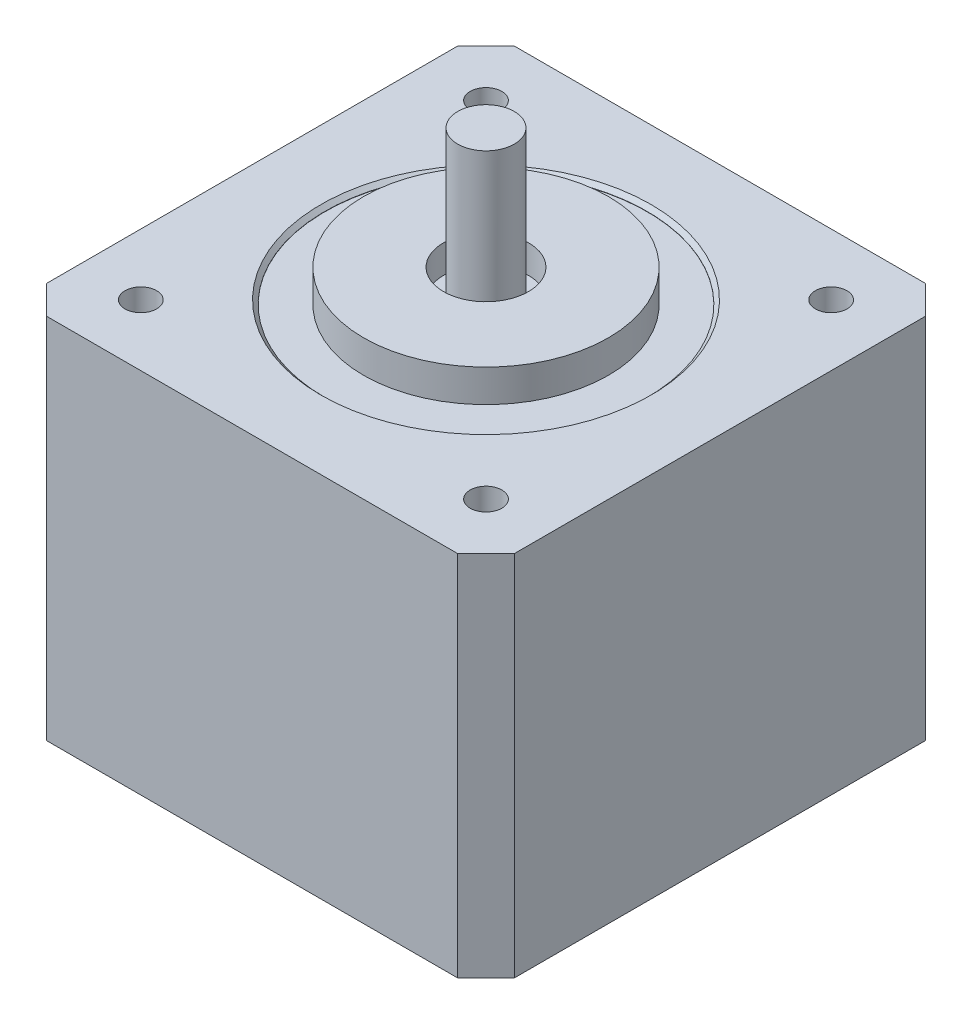
ISO-10303-21;
HEADER;
FILE_DESCRIPTION(('STEP AP214'),'2;1');
FILE_NAME('part.step','',(''),(''),'','','');
FILE_SCHEMA(('AUTOMOTIVE_DESIGN { 1 0 10303 214 1 1 1 1 }'));
ENDSEC;
DATA;
#1=APPLICATION_CONTEXT('core data for automotive mechanical design processes');
#2=APPLICATION_PROTOCOL_DEFINITION('international standard','automotive_design',2000,#1);
#3=PRODUCT_CONTEXT('',#1,'mechanical');
#4=PRODUCT('Part','Part','',(#3));
#5=PRODUCT_RELATED_PRODUCT_CATEGORY('part','',(#4));
#6=PRODUCT_DEFINITION_FORMATION('','',#4);
#7=PRODUCT_DEFINITION_CONTEXT('part definition',#1,'design');
#8=PRODUCT_DEFINITION('design','',#6,#7);
#9=PRODUCT_DEFINITION_SHAPE('','',#8);
#10=(LENGTH_UNIT() NAMED_UNIT(*) SI_UNIT(.MILLI.,.METRE.));
#11=(NAMED_UNIT(*) PLANE_ANGLE_UNIT() SI_UNIT($,.RADIAN.));
#12=(NAMED_UNIT(*) SI_UNIT($,.STERADIAN.) SOLID_ANGLE_UNIT());
#13=UNCERTAINTY_MEASURE_WITH_UNIT(LENGTH_MEASURE(1.E-05),#10,'distance_accuracy_value','');
#14=(GEOMETRIC_REPRESENTATION_CONTEXT(3) GLOBAL_UNCERTAINTY_ASSIGNED_CONTEXT((#13)) GLOBAL_UNIT_ASSIGNED_CONTEXT((#10,
#11,#12)) REPRESENTATION_CONTEXT('',''));
#15=CARTESIAN_POINT('',(0.,0.,0.));
#16=DIRECTION('',(0.,0.,1.));
#17=DIRECTION('',(1.,0.,0.));
#18=AXIS2_PLACEMENT_3D('',#15,#16,#17);
#19=CARTESIAN_POINT('',(21.0185,33.02,-21.0185));
#20=DIRECTION('',(0.,-1.,0.));
#21=DIRECTION('',(0.,0.,-1.));
#22=AXIS2_PLACEMENT_3D('',#19,#20,#21);
#23=PLANE('',#22);
#24=CARTESIAN_POINT('',(0.,33.02,0.));
#25=DIRECTION('',(0.,1.,0.));
#26=DIRECTION('',(0.,0.,1.));
#27=AXIS2_PLACEMENT_3D('',#24,#25,#26);
#28=CIRCLE('',#27,3.81);
#29=CARTESIAN_POINT('',(0.,33.02,3.81));
#30=VERTEX_POINT('',#29);
#31=EDGE_CURVE('E180',#30,#30,#28,.T.);
#32=ORIENTED_EDGE('',*,*,#31,.T.);
#33=EDGE_LOOP('',(#32));
#34=FACE_BOUND('',#33,.T.);
#35=CARTESIAN_POINT('',(0.,33.02,0.));
#36=DIRECTION('',(0.,-1.,0.));
#37=DIRECTION('',(0.,0.,-1.));
#38=AXIS2_PLACEMENT_3D('',#35,#36,#37);
#39=CIRCLE('',#38,2.54);
#40=CARTESIAN_POINT('',(0.,33.02,-2.54));
#41=VERTEX_POINT('',#40);
#42=EDGE_CURVE('E11',#41,#41,#39,.F.);
#43=ORIENTED_EDGE('',*,*,#42,.F.);
#44=EDGE_LOOP('',(#43));
#45=FACE_BOUND('',#44,.T.);
#46=ADVANCED_FACE('F32',(#34,#45),#23,.F.);
#47=CARTESIAN_POINT('',(0.,35.56,0.));
#48=DIRECTION('',(0.,1.,0.));
#49=DIRECTION('',(0.,0.,1.));
#50=AXIS2_PLACEMENT_3D('',#47,#48,#49);
#51=PLANE('',#50);
#52=CARTESIAN_POINT('',(0.,35.56,0.));
#53=DIRECTION('',(0.,1.,0.));
#54=DIRECTION('',(0.,0.,1.));
#55=AXIS2_PLACEMENT_3D('',#52,#53,#54);
#56=CIRCLE('',#55,10.9982);
#57=CARTESIAN_POINT('',(0.,35.56,10.9982));
#58=VERTEX_POINT('',#57);
#59=EDGE_CURVE('E192',#58,#58,#56,.T.);
#60=ORIENTED_EDGE('',*,*,#59,.T.);
#61=EDGE_LOOP('',(#60));
#62=FACE_BOUND('',#61,.T.);
#63=CARTESIAN_POINT('',(0.,35.56,0.));
#64=DIRECTION('',(0.,1.,0.));
#65=DIRECTION('',(0.,0.,1.));
#66=AXIS2_PLACEMENT_3D('',#63,#64,#65);
#67=CIRCLE('',#66,3.81);
#68=CARTESIAN_POINT('',(0.,35.56,3.81));
#69=VERTEX_POINT('',#68);
#70=EDGE_CURVE('E184',#69,#69,#67,.T.);
#71=ORIENTED_EDGE('',*,*,#70,.F.);
#72=EDGE_LOOP('',(#71));
#73=FACE_BOUND('',#72,.T.);
#74=ADVANCED_FACE('F228',(#62,#73),#51,.T.);
#75=CARTESIAN_POINT('',(0.,35.56,0.));
#76=DIRECTION('',(0.,-1.,0.));
#77=DIRECTION('',(0.,0.,-1.));
#78=AXIS2_PLACEMENT_3D('',#75,#76,#77);
#79=CYLINDRICAL_SURFACE('',#78,10.9982);
#80=ORIENTED_EDGE('',*,*,#59,.F.);
#81=EDGE_LOOP('',(#80));
#82=FACE_BOUND('',#81,.T.);
#83=CARTESIAN_POINT('',(0.,32.639,0.));
#84=DIRECTION('',(0.,1.,0.));
#85=DIRECTION('',(0.,0.,1.));
#86=AXIS2_PLACEMENT_3D('',#83,#84,#85);
#87=CIRCLE('',#86,10.9982);
#88=CARTESIAN_POINT('',(0.,32.639,10.9982));
#89=VERTEX_POINT('',#88);
#90=EDGE_CURVE('E181',#89,#89,#87,.T.);
#91=ORIENTED_EDGE('',*,*,#90,.T.);
#92=EDGE_LOOP('',(#91));
#93=FACE_BOUND('',#92,.T.);
#94=ADVANCED_FACE('F233',(#82,#93),#79,.T.);
#95=CARTESIAN_POINT('',(0.,35.56,0.));
#96=DIRECTION('',(0.,-1.,0.));
#97=DIRECTION('',(0.,0.,-1.));
#98=AXIS2_PLACEMENT_3D('',#95,#96,#97);
#99=CYLINDRICAL_SURFACE('',#98,3.81);
#100=ORIENTED_EDGE('',*,*,#70,.T.);
#101=EDGE_LOOP('',(#100));
#102=FACE_BOUND('',#101,.T.);
#103=ORIENTED_EDGE('',*,*,#31,.F.);
#104=EDGE_LOOP('',(#103));
#105=FACE_BOUND('',#104,.T.);
#106=ADVANCED_FACE('F174',(#102,#105),#99,.F.);
#107=CARTESIAN_POINT('',(0.,32.639,0.));
#108=DIRECTION('',(0.,1.,0.));
#109=DIRECTION('',(0.,0.,1.));
#110=AXIS2_PLACEMENT_3D('',#107,#108,#109);
#111=CYLINDRICAL_SURFACE('',#110,14.478);
#112=CARTESIAN_POINT('',(0.,32.6644,0.));
#113=DIRECTION('',(0.,-1.,0.));
#114=DIRECTION('',(0.,0.,-1.));
#115=AXIS2_PLACEMENT_3D('',#112,#113,#114);
#116=CIRCLE('',#115,14.478);
#117=CARTESIAN_POINT('',(0.,32.6644,14.478));
#118=VERTEX_POINT('',#117);
#119=EDGE_CURVE('E158',#118,#118,#116,.F.);
#120=CARTESIAN_POINT('',(0.,32.639,0.));
#121=DIRECTION('',(0.,1.,0.));
#122=DIRECTION('',(0.,0.,1.));
#123=AXIS2_PLACEMENT_3D('',#120,#121,#122);
#124=CIRCLE('',#123,14.478);
#125=CARTESIAN_POINT('',(0.,32.639,14.478));
#126=VERTEX_POINT('',#125);
#127=EDGE_CURVE('E178',#126,#126,#124,.T.);
#128=CARTESIAN_POINT('',(0.,32.6644,14.478));
#129=CARTESIAN_POINT('',(0.,32.6641354166666,14.478));
#130=CARTESIAN_POINT('',(0.,32.6638708333333,14.478));
#131=CARTESIAN_POINT('',(0.,32.6633416666666,14.478));
#132=CARTESIAN_POINT('',(0.,32.6630770833333,14.478));
#133=CARTESIAN_POINT('',(0.,32.6625479166666,14.478));
#134=CARTESIAN_POINT('',(0.,32.6622833333333,14.478));
#135=CARTESIAN_POINT('',(0.,32.6617541666666,14.478));
#136=CARTESIAN_POINT('',(0.,32.6614895833333,14.478));
#137=CARTESIAN_POINT('',(0.,32.6609604166666,14.478));
#138=CARTESIAN_POINT('',(0.,32.6606958333333,14.478));
#139=CARTESIAN_POINT('',(0.,32.6601666666666,14.478));
#140=CARTESIAN_POINT('',(0.,32.6599020833333,14.478));
#141=CARTESIAN_POINT('',(0.,32.6593729166666,14.478));
#142=CARTESIAN_POINT('',(0.,32.6591083333333,14.478));
#143=CARTESIAN_POINT('',(0.,32.6585791666666,14.478));
#144=CARTESIAN_POINT('',(0.,32.6583145833333,14.478));
#145=CARTESIAN_POINT('',(0.,32.6577854166666,14.478));
#146=CARTESIAN_POINT('',(0.,32.6575208333333,14.478));
#147=CARTESIAN_POINT('',(0.,32.6569916666666,14.478));
#148=CARTESIAN_POINT('',(0.,32.6567270833333,14.478));
#149=CARTESIAN_POINT('',(0.,32.6561979166666,14.478));
#150=CARTESIAN_POINT('',(0.,32.6559333333333,14.478));
#151=CARTESIAN_POINT('',(0.,32.6554041666666,14.478));
#152=CARTESIAN_POINT('',(0.,32.6551395833333,14.478));
#153=CARTESIAN_POINT('',(0.,32.6546104166666,14.478));
#154=CARTESIAN_POINT('',(0.,32.6543458333333,14.478));
#155=CARTESIAN_POINT('',(0.,32.6538166666666,14.478));
#156=CARTESIAN_POINT('',(0.,32.6535520833333,14.478));
#157=CARTESIAN_POINT('',(0.,32.6530229166666,14.478));
#158=CARTESIAN_POINT('',(0.,32.6527583333333,14.478));
#159=CARTESIAN_POINT('',(0.,32.6522291666666,14.478));
#160=CARTESIAN_POINT('',(0.,32.6519645833333,14.478));
#161=CARTESIAN_POINT('',(0.,32.6514354166666,14.478));
#162=CARTESIAN_POINT('',(0.,32.6511708333333,14.478));
#163=CARTESIAN_POINT('',(0.,32.6506416666666,14.478));
#164=CARTESIAN_POINT('',(0.,32.6503770833333,14.478));
#165=CARTESIAN_POINT('',(0.,32.6498479166666,14.478));
#166=CARTESIAN_POINT('',(0.,32.6495833333333,14.478));
#167=CARTESIAN_POINT('',(0.,32.6490541666666,14.478));
#168=CARTESIAN_POINT('',(0.,32.6487895833333,14.478));
#169=CARTESIAN_POINT('',(0.,32.6482604166666,14.478));
#170=CARTESIAN_POINT('',(0.,32.6479958333333,14.478));
#171=CARTESIAN_POINT('',(0.,32.6474666666666,14.478));
#172=CARTESIAN_POINT('',(0.,32.6472020833333,14.478));
#173=CARTESIAN_POINT('',(0.,32.6466729166666,14.478));
#174=CARTESIAN_POINT('',(0.,32.6464083333333,14.478));
#175=CARTESIAN_POINT('',(0.,32.6458791666666,14.478));
#176=CARTESIAN_POINT('',(0.,32.6456145833333,14.478));
#177=CARTESIAN_POINT('',(0.,32.6450854166667,14.478));
#178=CARTESIAN_POINT('',(0.,32.6448208333333,14.478));
#179=CARTESIAN_POINT('',(0.,32.6442916666667,14.478));
#180=CARTESIAN_POINT('',(0.,32.6440270833333,14.478));
#181=CARTESIAN_POINT('',(0.,32.6434979166667,14.478));
#182=CARTESIAN_POINT('',(0.,32.6432333333333,14.478));
#183=CARTESIAN_POINT('',(0.,32.6427041666667,14.478));
#184=CARTESIAN_POINT('',(0.,32.6424395833333,14.478));
#185=CARTESIAN_POINT('',(0.,32.6419104166667,14.478));
#186=CARTESIAN_POINT('',(0.,32.6416458333333,14.478));
#187=CARTESIAN_POINT('',(0.,32.6411166666667,14.478));
#188=CARTESIAN_POINT('',(0.,32.6408520833333,14.478));
#189=CARTESIAN_POINT('',(0.,32.6403229166667,14.478));
#190=CARTESIAN_POINT('',(0.,32.6400583333333,14.478));
#191=CARTESIAN_POINT('',(0.,32.6395291666667,14.478));
#192=CARTESIAN_POINT('',(0.,32.6392645833333,14.478));
#193=CARTESIAN_POINT('',(0.,32.639,14.478));
#194=B_SPLINE_CURVE_WITH_KNOTS('',3,(#128,#129,#130,#131,#132,#133,#134,#135,#136,#137,#138,
#139,#140,#141,#142,#143,#144,#145,#146,#147,#148,#149,#150,#151,#152,#153,#154,#155,#156,#157,
#158,#159,#160,#161,#162,#163,#164,#165,#166,#167,#168,#169,#170,#171,#172,#173,#174,#175,#176,
#177,#178,#179,#180,#181,#182,#183,#184,#185,#186,#187,#188,#189,#190,#191,#192,#193),
.UNSPECIFIED.,.F.,.F.,(4,2,2,2,2,2,2,2,2,2,2,2,2,2,2,2,2,2,2,2,2,2,2,2,2,2,2,2,2,2,2,2,4),(0.,
0.000793749999998539,0.00158749999999708,0.00238124999999562,0.00317499999999415,
0.00396874999999269,0.00476249999999123,0.00555624999998977,0.00634999999998831,
0.00714374999998685,0.00793749999998539,0.00873124999998393,0.00952499999998246,
0.010318749999981,0.0111124999999795,0.0119062499999781,0.0126999999999766,0.0134937499999752,
0.0142874999999737,0.0150812499999722,0.0158749999999708,0.0166687499999693,0.0174624999999679,
0.0182562499999664,0.0190499999999649,0.0198437499999635,0.020637499999962,0.0214312499999605,
0.0222249999999591,0.0230187499999576,0.0238124999999562,0.0246062499999547,0.0253999999999463),.UNSPECIFIED.);
#195=EDGE_CURVE('BSEAM170',#118,#126,#194,.T.);
#196=ORIENTED_EDGE('',*,*,#119,.T.);
#197=ORIENTED_EDGE('',*,*,#127,.F.);
#198=ORIENTED_EDGE('',*,*,#195,.T.);
#199=ORIENTED_EDGE('',*,*,#195,.F.);
#200=EDGE_LOOP('',(#196,#198,#197,#199));
#201=FACE_BOUND('',#200,.T.);
#202=ADVANCED_FACE('F170',(#201),#111,.F.);
#203=CARTESIAN_POINT('',(0.,32.639,0.));
#204=DIRECTION('',(0.,1.,0.));
#205=DIRECTION('',(0.,0.,1.));
#206=AXIS2_PLACEMENT_3D('',#203,#204,#205);
#207=PLANE('',#206);
#208=ORIENTED_EDGE('',*,*,#90,.F.);
#209=EDGE_LOOP('',(#208));
#210=FACE_BOUND('',#209,.T.);
#211=ORIENTED_EDGE('',*,*,#127,.T.);
#212=EDGE_LOOP('',(#211));
#213=FACE_BOUND('',#212,.T.);
#214=ADVANCED_FACE('F173',(#210,#213),#207,.T.);
#215=CARTESIAN_POINT('',(21.0185,0.,-21.0185));
#216=DIRECTION('',(0.,-1.,0.));
#217=DIRECTION('',(0.,0.,-1.));
#218=AXIS2_PLACEMENT_3D('',#215,#216,#217);
#219=PLANE('',#218);
#220=CARTESIAN_POINT('',(15.5067,0.,15.5067));
#221=DIRECTION('',(0.,1.,0.));
#222=DIRECTION('',(0.,0.,1.));
#223=AXIS2_PLACEMENT_3D('',#220,#221,#222);
#224=CIRCLE('',#223,1.4224);
#225=CARTESIAN_POINT('',(15.5067,0.,16.9291));
#226=VERTEX_POINT('',#225);
#227=EDGE_CURVE('E394',#226,#226,#224,.T.);
#228=ORIENTED_EDGE('',*,*,#227,.T.);
#229=EDGE_LOOP('',(#228));
#230=FACE_BOUND('',#229,.T.);
#231=CARTESIAN_POINT('',(-15.5067,0.,15.5067));
#232=DIRECTION('',(0.,1.,0.));
#233=DIRECTION('',(0.,0.,1.));
#234=AXIS2_PLACEMENT_3D('',#231,#232,#233);
#235=CIRCLE('',#234,1.4224);
#236=CARTESIAN_POINT('',(-15.5067,0.,16.9291));
#237=VERTEX_POINT('',#236);
#238=EDGE_CURVE('E388',#237,#237,#235,.T.);
#239=ORIENTED_EDGE('',*,*,#238,.T.);
#240=EDGE_LOOP('',(#239));
#241=FACE_BOUND('',#240,.T.);
#242=CARTESIAN_POINT('',(15.5067,0.,-15.5067));
#243=DIRECTION('',(0.,1.,0.));
#244=DIRECTION('',(0.,0.,1.));
#245=AXIS2_PLACEMENT_3D('',#242,#243,#244);
#246=CIRCLE('',#245,1.4224);
#247=CARTESIAN_POINT('',(15.5067,0.,-14.0843));
#248=VERTEX_POINT('',#247);
#249=EDGE_CURVE('E383',#248,#248,#246,.T.);
#250=ORIENTED_EDGE('',*,*,#249,.T.);
#251=EDGE_LOOP('',(#250));
#252=FACE_BOUND('',#251,.T.);
#253=CARTESIAN_POINT('',(-15.5067,0.,-15.5067));
#254=DIRECTION('',(0.,1.,0.));
#255=DIRECTION('',(0.,0.,1.));
#256=AXIS2_PLACEMENT_3D('',#253,#254,#255);
#257=CIRCLE('',#256,1.4224);
#258=CARTESIAN_POINT('',(-15.5067,0.,-14.0843));
#259=VERTEX_POINT('',#258);
#260=EDGE_CURVE('E377',#259,#259,#257,.T.);
#261=ORIENTED_EDGE('',*,*,#260,.T.);
#262=EDGE_LOOP('',(#261));
#263=FACE_BOUND('',#262,.T.);
#264=DIRECTION('',(0.,0.,1.));
#265=VECTOR('',#264,1.);
#266=CARTESIAN_POINT('',(-21.0185,0.,21.0185));
#267=LINE('',#266,#265);
#268=CARTESIAN_POINT('',(-21.0185,0.,-18.4785));
#269=VERTEX_POINT('',#268);
#270=CARTESIAN_POINT('',(-21.0185,0.,18.4785));
#271=VERTEX_POINT('',#270);
#272=EDGE_CURVE('E116',#269,#271,#267,.T.);
#273=ORIENTED_EDGE('',*,*,#272,.F.);
#274=DIRECTION('',(-0.707106781186549,0.,0.707106781186546));
#275=VECTOR('',#274,1.);
#276=CARTESIAN_POINT('',(1.2700000000001,0.,-40.767));
#277=LINE('',#276,#275);
#278=CARTESIAN_POINT('',(-18.4785,0.,-21.0185));
#279=VERTEX_POINT('',#278);
#280=EDGE_CURVE('E99',#269,#279,#277,.F.);
#281=ORIENTED_EDGE('',*,*,#280,.T.);
#282=DIRECTION('',(-1.,0.,0.));
#283=VECTOR('',#282,1.);
#284=CARTESIAN_POINT('',(-21.0185,0.,-21.0185));
#285=LINE('',#284,#283);
#286=CARTESIAN_POINT('',(18.4785,0.,-21.0185));
#287=VERTEX_POINT('',#286);
#288=EDGE_CURVE('E125',#287,#279,#285,.T.);
#289=ORIENTED_EDGE('',*,*,#288,.F.);
#290=DIRECTION('',(-0.707106781186546,0.,-0.707106781186549));
#291=VECTOR('',#290,1.);
#292=CARTESIAN_POINT('',(19.7485,0.,-19.7485));
#293=LINE('',#292,#291);
#294=CARTESIAN_POINT('',(21.0185,0.,-18.4785));
#295=VERTEX_POINT('',#294);
#296=EDGE_CURVE('E136',#287,#295,#293,.F.);
#297=ORIENTED_EDGE('',*,*,#296,.T.);
#298=DIRECTION('',(0.,0.,-1.));
#299=VECTOR('',#298,1.);
#300=CARTESIAN_POINT('',(21.0185,0.,21.0185));
#301=LINE('',#300,#299);
#302=CARTESIAN_POINT('',(21.0185,0.,18.4785));
#303=VERTEX_POINT('',#302);
#304=EDGE_CURVE('E129',#303,#295,#301,.T.);
#305=ORIENTED_EDGE('',*,*,#304,.F.);
#306=DIRECTION('',(0.707106781186549,0.,-0.707106781186546));
#307=VECTOR('',#306,1.);
#308=CARTESIAN_POINT('',(40.767,0.,-1.26999999999988));
#309=LINE('',#308,#307);
#310=CARTESIAN_POINT('',(18.4785,0.,21.0185));
#311=VERTEX_POINT('',#310);
#312=EDGE_CURVE('E119',#303,#311,#309,.F.);
#313=ORIENTED_EDGE('',*,*,#312,.T.);
#314=DIRECTION('',(1.,0.,0.));
#315=VECTOR('',#314,1.);
#316=CARTESIAN_POINT('',(-21.0185,0.,21.0185));
#317=LINE('',#316,#315);
#318=CARTESIAN_POINT('',(-18.4785,0.,21.0185));
#319=VERTEX_POINT('',#318);
#320=EDGE_CURVE('E124',#319,#311,#317,.T.);
#321=ORIENTED_EDGE('',*,*,#320,.F.);
#322=DIRECTION('',(0.707106781186546,0.,0.707106781186549));
#323=VECTOR('',#322,1.);
#324=CARTESIAN_POINT('',(-19.7485000000001,0.,19.7484999999999));
#325=LINE('',#324,#323);
#326=EDGE_CURVE('E110',#319,#271,#325,.F.);
#327=ORIENTED_EDGE('',*,*,#326,.T.);
#328=EDGE_LOOP('',(#273,#281,#289,#297,#305,#313,#321,#327));
#329=FACE_BOUND('',#328,.T.);
#330=ADVANCED_FACE('F122',(#230,#241,#252,#263,#329),#219,.T.);
#331=CARTESIAN_POINT('',(18.4785,33.02,-21.0185));
#332=DIRECTION('',(-0.707106781186549,0.,0.707106781186546));
#333=DIRECTION('',(0.707106781186546,0.,0.707106781186549));
#334=AXIS2_PLACEMENT_3D('',#331,#332,#333);
#335=PLANE('',#334);
#336=DIRECTION('',(0.707106781186546,0.,0.707106781186549));
#337=VECTOR('',#336,1.);
#338=CARTESIAN_POINT('',(18.4785,33.02,-21.0185));
#339=LINE('',#338,#337);
#340=CARTESIAN_POINT('',(21.0185,33.02,-18.4785));
#341=VERTEX_POINT('',#340);
#342=CARTESIAN_POINT('',(18.4785,33.02,-21.0185));
#343=VERTEX_POINT('',#342);
#344=EDGE_CURVE('E144',#341,#343,#339,.F.);
#345=ORIENTED_EDGE('',*,*,#344,.F.);
#346=DIRECTION('',(0.,1.,0.));
#347=VECTOR('',#346,1.);
#348=CARTESIAN_POINT('',(21.0185,33.02,-18.4785));
#349=LINE('',#348,#347);
#350=EDGE_CURVE('E156',#295,#341,#349,.T.);
#351=ORIENTED_EDGE('',*,*,#350,.F.);
#352=ORIENTED_EDGE('',*,*,#296,.F.);
#353=DIRECTION('',(0.,-1.,0.));
#354=VECTOR('',#353,1.);
#355=CARTESIAN_POINT('',(18.4785,33.02,-21.0185));
#356=LINE('',#355,#354);
#357=EDGE_CURVE('E109',#343,#287,#356,.T.);
#358=ORIENTED_EDGE('',*,*,#357,.F.);
#359=EDGE_LOOP('',(#345,#351,#352,#358));
#360=FACE_BOUND('',#359,.T.);
#361=ADVANCED_FACE('F211',(#360),#335,.F.);
#362=CARTESIAN_POINT('',(21.0185,33.02,21.0185));
#363=DIRECTION('',(-1.,0.,0.));
#364=DIRECTION('',(0.,0.,1.));
#365=AXIS2_PLACEMENT_3D('',#362,#363,#364);
#366=PLANE('',#365);
#367=ORIENTED_EDGE('',*,*,#304,.T.);
#368=ORIENTED_EDGE('',*,*,#350,.T.);
#369=DIRECTION('',(0.,0.,-1.));
#370=VECTOR('',#369,1.);
#371=CARTESIAN_POINT('',(21.0185,33.02,21.0185));
#372=LINE('',#371,#370);
#373=CARTESIAN_POINT('',(21.0185,33.02,18.4785));
#374=VERTEX_POINT('',#373);
#375=EDGE_CURVE('E127',#374,#341,#372,.T.);
#376=ORIENTED_EDGE('',*,*,#375,.F.);
#377=DIRECTION('',(0.,-1.,0.));
#378=VECTOR('',#377,1.);
#379=CARTESIAN_POINT('',(21.0185,33.02,18.4785));
#380=LINE('',#379,#378);
#381=EDGE_CURVE('E153',#374,#303,#380,.T.);
#382=ORIENTED_EDGE('',*,*,#381,.T.);
#383=EDGE_LOOP('',(#367,#368,#376,#382));
#384=FACE_BOUND('',#383,.T.);
#385=ADVANCED_FACE('F206',(#384),#366,.F.);
#386=CARTESIAN_POINT('',(21.0185,33.02,18.4785));
#387=DIRECTION('',(-0.707106781186546,0.,-0.707106781186549));
#388=DIRECTION('',(-0.707106781186549,0.,0.707106781186546));
#389=AXIS2_PLACEMENT_3D('',#386,#387,#388);
#390=PLANE('',#389);
#391=DIRECTION('',(-0.707106781186549,0.,0.707106781186546));
#392=VECTOR('',#391,1.);
#393=CARTESIAN_POINT('',(21.0185,33.02,18.4785));
#394=LINE('',#393,#392);
#395=CARTESIAN_POINT('',(18.4785,33.02,21.0185));
#396=VERTEX_POINT('',#395);
#397=EDGE_CURVE('E142',#396,#374,#394,.F.);
#398=ORIENTED_EDGE('',*,*,#397,.F.);
#399=DIRECTION('',(0.,1.,0.));
#400=VECTOR('',#399,1.);
#401=CARTESIAN_POINT('',(18.4785,33.02,21.0185));
#402=LINE('',#401,#400);
#403=EDGE_CURVE('E47',#311,#396,#402,.T.);
#404=ORIENTED_EDGE('',*,*,#403,.F.);
#405=ORIENTED_EDGE('',*,*,#312,.F.);
#406=ORIENTED_EDGE('',*,*,#381,.F.);
#407=EDGE_LOOP('',(#398,#404,#405,#406));
#408=FACE_BOUND('',#407,.T.);
#409=ADVANCED_FACE('F245',(#408),#390,.F.);
#410=CARTESIAN_POINT('',(-21.0185,33.02,21.0185));
#411=DIRECTION('',(0.,0.,-1.));
#412=DIRECTION('',(-1.,0.,0.));
#413=AXIS2_PLACEMENT_3D('',#410,#411,#412);
#414=PLANE('',#413);
#415=DIRECTION('',(1.,0.,0.));
#416=VECTOR('',#415,1.);
#417=CARTESIAN_POINT('',(-21.0185,33.02,21.0185));
#418=LINE('',#417,#416);
#419=CARTESIAN_POINT('',(-18.4785,33.02,21.0185));
#420=VERTEX_POINT('',#419);
#421=EDGE_CURVE('E133',#420,#396,#418,.T.);
#422=ORIENTED_EDGE('',*,*,#421,.F.);
#423=DIRECTION('',(0.,-1.,0.));
#424=VECTOR('',#423,1.);
#425=CARTESIAN_POINT('',(-18.4785,33.02,21.0185));
#426=LINE('',#425,#424);
#427=EDGE_CURVE('E150',#420,#319,#426,.T.);
#428=ORIENTED_EDGE('',*,*,#427,.T.);
#429=ORIENTED_EDGE('',*,*,#320,.T.);
#430=ORIENTED_EDGE('',*,*,#403,.T.);
#431=EDGE_LOOP('',(#422,#428,#429,#430));
#432=FACE_BOUND('',#431,.T.);
#433=ADVANCED_FACE('F242',(#432),#414,.F.);
#434=CARTESIAN_POINT('',(-18.4785,33.02,21.0185));
#435=DIRECTION('',(0.707106781186549,0.,-0.707106781186546));
#436=DIRECTION('',(-0.707106781186546,0.,-0.707106781186549));
#437=AXIS2_PLACEMENT_3D('',#434,#435,#436);
#438=PLANE('',#437);
#439=DIRECTION('',(-0.707106781186546,0.,-0.707106781186549));
#440=VECTOR('',#439,1.);
#441=CARTESIAN_POINT('',(-18.4785,33.02,21.0185));
#442=LINE('',#441,#440);
#443=CARTESIAN_POINT('',(-21.0185,33.02,18.4785));
#444=VERTEX_POINT('',#443);
#445=EDGE_CURVE('E54',#444,#420,#442,.F.);
#446=ORIENTED_EDGE('',*,*,#445,.F.);
#447=DIRECTION('',(0.,1.,0.));
#448=VECTOR('',#447,1.);
#449=CARTESIAN_POINT('',(-21.0185,33.02,18.4785));
#450=LINE('',#449,#448);
#451=EDGE_CURVE('E120',#271,#444,#450,.T.);
#452=ORIENTED_EDGE('',*,*,#451,.F.);
#453=ORIENTED_EDGE('',*,*,#326,.F.);
#454=ORIENTED_EDGE('',*,*,#427,.F.);
#455=EDGE_LOOP('',(#446,#452,#453,#454));
#456=FACE_BOUND('',#455,.T.);
#457=ADVANCED_FACE('F244',(#456),#438,.F.);
#458=CARTESIAN_POINT('',(-21.0185,33.02,21.0185));
#459=DIRECTION('',(1.,0.,0.));
#460=DIRECTION('',(0.,0.,-1.));
#461=AXIS2_PLACEMENT_3D('',#458,#459,#460);
#462=PLANE('',#461);
#463=DIRECTION('',(0.,0.,1.));
#464=VECTOR('',#463,1.);
#465=CARTESIAN_POINT('',(-21.0185,33.02,21.0185));
#466=LINE('',#465,#464);
#467=CARTESIAN_POINT('',(-21.0185,33.02,-18.4785));
#468=VERTEX_POINT('',#467);
#469=EDGE_CURVE('E118',#468,#444,#466,.T.);
#470=ORIENTED_EDGE('',*,*,#469,.F.);
#471=DIRECTION('',(0.,-1.,0.));
#472=VECTOR('',#471,1.);
#473=CARTESIAN_POINT('',(-21.0185,33.02,-18.4785));
#474=LINE('',#473,#472);
#475=EDGE_CURVE('E103',#468,#269,#474,.T.);
#476=ORIENTED_EDGE('',*,*,#475,.T.);
#477=ORIENTED_EDGE('',*,*,#272,.T.);
#478=ORIENTED_EDGE('',*,*,#451,.T.);
#479=EDGE_LOOP('',(#470,#476,#477,#478));
#480=FACE_BOUND('',#479,.T.);
#481=ADVANCED_FACE('F115',(#480),#462,.F.);
#482=CARTESIAN_POINT('',(-21.0185,33.02,-18.4785));
#483=DIRECTION('',(0.707106781186546,0.,0.707106781186549));
#484=DIRECTION('',(0.707106781186549,0.,-0.707106781186546));
#485=AXIS2_PLACEMENT_3D('',#482,#483,#484);
#486=PLANE('',#485);
#487=DIRECTION('',(0.707106781186549,0.,-0.707106781186546));
#488=VECTOR('',#487,1.);
#489=CARTESIAN_POINT('',(-21.0185,33.02,-18.4785));
#490=LINE('',#489,#488);
#491=CARTESIAN_POINT('',(-18.4785,33.02,-21.0185));
#492=VERTEX_POINT('',#491);
#493=EDGE_CURVE('E147',#492,#468,#490,.F.);
#494=ORIENTED_EDGE('',*,*,#493,.F.);
#495=DIRECTION('',(0.,1.,0.));
#496=VECTOR('',#495,1.);
#497=CARTESIAN_POINT('',(-18.4785,33.02,-21.0185));
#498=LINE('',#497,#496);
#499=EDGE_CURVE('E104',#279,#492,#498,.T.);
#500=ORIENTED_EDGE('',*,*,#499,.F.);
#501=ORIENTED_EDGE('',*,*,#280,.F.);
#502=ORIENTED_EDGE('',*,*,#475,.F.);
#503=EDGE_LOOP('',(#494,#500,#501,#502));
#504=FACE_BOUND('',#503,.T.);
#505=ADVANCED_FACE('F102',(#504),#486,.F.);
#506=CARTESIAN_POINT('',(-21.0185,33.02,-21.0185));
#507=DIRECTION('',(0.,0.,1.));
#508=DIRECTION('',(1.,0.,0.));
#509=AXIS2_PLACEMENT_3D('',#506,#507,#508);
#510=PLANE('',#509);
#511=ORIENTED_EDGE('',*,*,#288,.T.);
#512=ORIENTED_EDGE('',*,*,#499,.T.);
#513=DIRECTION('',(-1.,0.,0.));
#514=VECTOR('',#513,1.);
#515=CARTESIAN_POINT('',(-21.0185,33.02,-21.0185));
#516=LINE('',#515,#514);
#517=EDGE_CURVE('E198',#343,#492,#516,.T.);
#518=ORIENTED_EDGE('',*,*,#517,.F.);
#519=ORIENTED_EDGE('',*,*,#357,.T.);
#520=EDGE_LOOP('',(#511,#512,#518,#519));
#521=FACE_BOUND('',#520,.T.);
#522=ADVANCED_FACE('F215',(#521),#510,.F.);
#523=CARTESIAN_POINT('',(15.5067,33.02,15.5067));
#524=DIRECTION('',(0.,1.,0.));
#525=DIRECTION('',(0.,0.,1.));
#526=AXIS2_PLACEMENT_3D('',#523,#524,#525);
#527=CIRCLE('',#526,1.4224);
#528=CARTESIAN_POINT('',(15.5067,33.02,16.9291));
#529=VERTEX_POINT('',#528);
#530=EDGE_CURVE('E397',#529,#529,#527,.T.);
#531=ORIENTED_EDGE('',*,*,#530,.F.);
#532=EDGE_LOOP('',(#531));
#533=FACE_BOUND('',#532,.T.);
#534=CARTESIAN_POINT('',(-15.5067,33.02,15.5067));
#535=DIRECTION('',(0.,1.,0.));
#536=DIRECTION('',(0.,0.,1.));
#537=AXIS2_PLACEMENT_3D('',#534,#535,#536);
#538=CIRCLE('',#537,1.4224);
#539=CARTESIAN_POINT('',(-15.5067,33.02,16.9291));
#540=VERTEX_POINT('',#539);
#541=EDGE_CURVE('E391',#540,#540,#538,.T.);
#542=ORIENTED_EDGE('',*,*,#541,.F.);
#543=EDGE_LOOP('',(#542));
#544=FACE_BOUND('',#543,.T.);
#545=CARTESIAN_POINT('',(15.5067,33.02,-15.5067));
#546=DIRECTION('',(0.,1.,0.));
#547=DIRECTION('',(0.,0.,1.));
#548=AXIS2_PLACEMENT_3D('',#545,#546,#547);
#549=CIRCLE('',#548,1.4224);
#550=CARTESIAN_POINT('',(15.5067,33.02,-14.0843));
#551=VERTEX_POINT('',#550);
#552=EDGE_CURVE('E385',#551,#551,#549,.T.);
#553=ORIENTED_EDGE('',*,*,#552,.F.);
#554=EDGE_LOOP('',(#553));
#555=FACE_BOUND('',#554,.T.);
#556=CARTESIAN_POINT('',(-15.5067,33.02,-15.5067));
#557=DIRECTION('',(0.,1.,0.));
#558=DIRECTION('',(0.,0.,1.));
#559=AXIS2_PLACEMENT_3D('',#556,#557,#558);
#560=CIRCLE('',#559,1.4224);
#561=CARTESIAN_POINT('',(-15.5067,33.02,-14.0843));
#562=VERTEX_POINT('',#561);
#563=EDGE_CURVE('E379',#562,#562,#560,.T.);
#564=ORIENTED_EDGE('',*,*,#563,.F.);
#565=EDGE_LOOP('',(#564));
#566=FACE_BOUND('',#565,.T.);
#567=CARTESIAN_POINT('',(0.,33.02,0.));
#568=DIRECTION('',(0.,-1.,0.));
#569=DIRECTION('',(0.,0.,-1.));
#570=AXIS2_PLACEMENT_3D('',#567,#568,#569);
#571=CIRCLE('',#570,14.8336000000001);
#572=CARTESIAN_POINT('',(0.,33.02,-14.8336000000001));
#573=VERTEX_POINT('',#572);
#574=EDGE_CURVE('E40',#573,#573,#571,.T.);
#575=ORIENTED_EDGE('',*,*,#574,.T.);
#576=EDGE_LOOP('',(#575));
#577=FACE_BOUND('',#576,.T.);
#578=ORIENTED_EDGE('',*,*,#517,.T.);
#579=ORIENTED_EDGE('',*,*,#493,.T.);
#580=ORIENTED_EDGE('',*,*,#469,.T.);
#581=ORIENTED_EDGE('',*,*,#445,.T.);
#582=ORIENTED_EDGE('',*,*,#421,.T.);
#583=ORIENTED_EDGE('',*,*,#397,.T.);
#584=ORIENTED_EDGE('',*,*,#375,.T.);
#585=ORIENTED_EDGE('',*,*,#344,.T.);
#586=EDGE_LOOP('',(#578,#579,#580,#581,#582,#583,#584,#585));
#587=FACE_BOUND('',#586,.T.);
#588=ADVANCED_FACE('F163',(#533,#544,#555,#566,#577,#587),#23,.F.);
#589=CARTESIAN_POINT('',(0.,32.6644,0.));
#590=DIRECTION('',(0.,1.,0.));
#591=DIRECTION('',(0.,0.,1.));
#592=AXIS2_PLACEMENT_3D('',#589,#590,#591);
#593=CONICAL_SURFACE('',#592,14.478,0.785398163397456);
#594=ORIENTED_EDGE('',*,*,#574,.F.);
#595=EDGE_LOOP('',(#594));
#596=FACE_BOUND('',#595,.T.);
#597=ORIENTED_EDGE('',*,*,#119,.F.);
#598=EDGE_LOOP('',(#597));
#599=FACE_BOUND('',#598,.T.);
#600=ADVANCED_FACE('F34',(#596,#599),#593,.F.);
#601=CARTESIAN_POINT('',(0.,46.4058,0.));
#602=DIRECTION('',(0.,-1.,0.));
#603=DIRECTION('',(0.,0.,-1.));
#604=AXIS2_PLACEMENT_3D('',#601,#602,#603);
#605=CYLINDRICAL_SURFACE('',#604,2.54);
#606=CARTESIAN_POINT('',(0.,46.4058,0.));
#607=DIRECTION('',(0.,1.,0.));
#608=DIRECTION('',(0.,0.,1.));
#609=AXIS2_PLACEMENT_3D('',#606,#607,#608);
#610=CIRCLE('',#609,2.54);
#611=CARTESIAN_POINT('',(0.,46.4058,2.54));
#612=VERTEX_POINT('',#611);
#613=EDGE_CURVE('E187',#612,#612,#610,.T.);
#614=ORIENTED_EDGE('',*,*,#613,.F.);
#615=EDGE_LOOP('',(#614));
#616=FACE_BOUND('',#615,.T.);
#617=ORIENTED_EDGE('',*,*,#42,.T.);
#618=EDGE_LOOP('',(#617));
#619=FACE_BOUND('',#618,.T.);
#620=ADVANCED_FACE('F167',(#616,#619),#605,.T.);
#621=CARTESIAN_POINT('',(0.,46.4058,0.));
#622=DIRECTION('',(0.,1.,0.));
#623=DIRECTION('',(0.,0.,1.));
#624=AXIS2_PLACEMENT_3D('',#621,#622,#623);
#625=PLANE('',#624);
#626=ORIENTED_EDGE('',*,*,#613,.T.);
#627=EDGE_LOOP('',(#626));
#628=FACE_BOUND('',#627,.T.);
#629=ADVANCED_FACE('F328',(#628),#625,.T.);
#630=CARTESIAN_POINT('',(-15.5067,0.,-15.5067));
#631=DIRECTION('',(0.,1.,0.));
#632=DIRECTION('',(0.,0.,1.));
#633=AXIS2_PLACEMENT_3D('',#630,#631,#632);
#634=CYLINDRICAL_SURFACE('',#633,1.4224);
#635=ORIENTED_EDGE('',*,*,#260,.F.);
#636=EDGE_LOOP('',(#635));
#637=FACE_BOUND('',#636,.T.);
#638=ORIENTED_EDGE('',*,*,#563,.T.);
#639=EDGE_LOOP('',(#638));
#640=FACE_BOUND('',#639,.T.);
#641=ADVANCED_FACE('F322',(#637,#640),#634,.F.);
#642=CARTESIAN_POINT('',(15.5067,0.,-15.5067));
#643=DIRECTION('',(0.,1.,0.));
#644=DIRECTION('',(0.,0.,1.));
#645=AXIS2_PLACEMENT_3D('',#642,#643,#644);
#646=CYLINDRICAL_SURFACE('',#645,1.4224);
#647=ORIENTED_EDGE('',*,*,#249,.F.);
#648=EDGE_LOOP('',(#647));
#649=FACE_BOUND('',#648,.T.);
#650=ORIENTED_EDGE('',*,*,#552,.T.);
#651=EDGE_LOOP('',(#650));
#652=FACE_BOUND('',#651,.T.);
#653=ADVANCED_FACE('F327',(#649,#652),#646,.F.);
#654=CARTESIAN_POINT('',(-15.5067,0.,15.5067));
#655=DIRECTION('',(0.,1.,0.));
#656=DIRECTION('',(0.,0.,1.));
#657=AXIS2_PLACEMENT_3D('',#654,#655,#656);
#658=CYLINDRICAL_SURFACE('',#657,1.4224);
#659=ORIENTED_EDGE('',*,*,#238,.F.);
#660=EDGE_LOOP('',(#659));
#661=FACE_BOUND('',#660,.T.);
#662=ORIENTED_EDGE('',*,*,#541,.T.);
#663=EDGE_LOOP('',(#662));
#664=FACE_BOUND('',#663,.T.);
#665=ADVANCED_FACE('F340',(#661,#664),#658,.F.);
#666=CARTESIAN_POINT('',(15.5067,0.,15.5067));
#667=DIRECTION('',(0.,1.,0.));
#668=DIRECTION('',(0.,0.,1.));
#669=AXIS2_PLACEMENT_3D('',#666,#667,#668);
#670=CYLINDRICAL_SURFACE('',#669,1.4224);
#671=ORIENTED_EDGE('',*,*,#227,.F.);
#672=EDGE_LOOP('',(#671));
#673=FACE_BOUND('',#672,.T.);
#674=ORIENTED_EDGE('',*,*,#530,.T.);
#675=EDGE_LOOP('',(#674));
#676=FACE_BOUND('',#675,.T.);
#677=ADVANCED_FACE('F350',(#673,#676),#670,.F.);
#678=CLOSED_SHELL('',(#46,#74,#94,#106,#202,#214,#330,#361,#385,#409,#433,#457,#481,#505,#522,
#588,#600,#620,#629,#641,#653,#665,#677));
#679=MANIFOLD_SOLID_BREP('B2',#678);
#680=ADVANCED_BREP_SHAPE_REPRESENTATION('',(#18,#679),#14);
#681=SHAPE_DEFINITION_REPRESENTATION(#9,#680);
ENDSEC;
END-ISO-10303-21;
